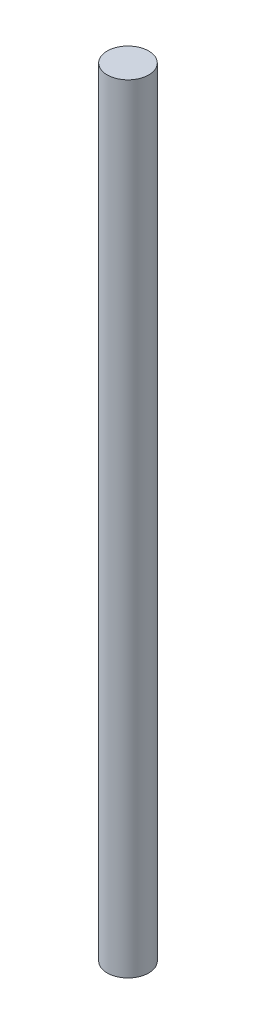
ISO-10303-21;
HEADER;
FILE_DESCRIPTION(('STEP AP214'),'2;1');
FILE_NAME('part.step','',(''),(''),'','','');
FILE_SCHEMA(('AUTOMOTIVE_DESIGN { 1 0 10303 214 1 1 1 1 }'));
ENDSEC;
DATA;
#1=APPLICATION_CONTEXT('core data for automotive mechanical design processes');
#2=APPLICATION_PROTOCOL_DEFINITION('international standard','automotive_design',2000,#1);
#3=PRODUCT_CONTEXT('',#1,'mechanical');
#4=PRODUCT('Part','Part','',(#3));
#5=PRODUCT_RELATED_PRODUCT_CATEGORY('part','',(#4));
#6=PRODUCT_DEFINITION_FORMATION('','',#4);
#7=PRODUCT_DEFINITION_CONTEXT('part definition',#1,'design');
#8=PRODUCT_DEFINITION('design','',#6,#7);
#9=PRODUCT_DEFINITION_SHAPE('','',#8);
#10=(LENGTH_UNIT() NAMED_UNIT(*) SI_UNIT(.MILLI.,.METRE.));
#11=(NAMED_UNIT(*) PLANE_ANGLE_UNIT() SI_UNIT($,.RADIAN.));
#12=(NAMED_UNIT(*) SI_UNIT($,.STERADIAN.) SOLID_ANGLE_UNIT());
#13=UNCERTAINTY_MEASURE_WITH_UNIT(LENGTH_MEASURE(1.E-05),#10,'distance_accuracy_value','');
#14=(GEOMETRIC_REPRESENTATION_CONTEXT(3) GLOBAL_UNCERTAINTY_ASSIGNED_CONTEXT((#13)) GLOBAL_UNIT_ASSIGNED_CONTEXT((#10,
#11,#12)) REPRESENTATION_CONTEXT('',''));
#15=CARTESIAN_POINT('',(0.,0.,0.));
#16=DIRECTION('',(0.,0.,1.));
#17=DIRECTION('',(1.,0.,0.));
#18=AXIS2_PLACEMENT_3D('',#15,#16,#17);
#19=CARTESIAN_POINT('',(0.,952.5,0.));
#20=DIRECTION('',(0.,-1.,0.));
#21=DIRECTION('',(0.,0.,-1.));
#22=AXIS2_PLACEMENT_3D('',#19,#20,#21);
#23=CYLINDRICAL_SURFACE('',#22,25.4);
#24=CARTESIAN_POINT('',(0.,952.5,0.));
#25=DIRECTION('',(0.,1.,0.));
#26=DIRECTION('',(0.,0.,1.));
#27=AXIS2_PLACEMENT_3D('',#24,#25,#26);
#28=CIRCLE('',#27,25.4);
#29=CARTESIAN_POINT('',(0.,952.5,25.4));
#30=VERTEX_POINT('',#29);
#31=EDGE_CURVE('E10',#30,#30,#28,.T.);
#32=ORIENTED_EDGE('',*,*,#31,.F.);
#33=EDGE_LOOP('',(#32));
#34=FACE_BOUND('',#33,.T.);
#35=CARTESIAN_POINT('',(0.,0.,0.));
#36=DIRECTION('',(0.,1.,0.));
#37=DIRECTION('',(0.,0.,1.));
#38=AXIS2_PLACEMENT_3D('',#35,#36,#37);
#39=CIRCLE('',#38,25.4);
#40=CARTESIAN_POINT('',(0.,0.,25.4));
#41=VERTEX_POINT('',#40);
#42=EDGE_CURVE('E40',#41,#41,#39,.T.);
#43=ORIENTED_EDGE('',*,*,#42,.T.);
#44=EDGE_LOOP('',(#43));
#45=FACE_BOUND('',#44,.T.);
#46=ADVANCED_FACE('F37',(#34,#45),#23,.T.);
#47=CARTESIAN_POINT('',(0.,952.5,0.));
#48=DIRECTION('',(0.,1.,0.));
#49=DIRECTION('',(0.,0.,1.));
#50=AXIS2_PLACEMENT_3D('',#47,#48,#49);
#51=PLANE('',#50);
#52=ORIENTED_EDGE('',*,*,#31,.T.);
#53=EDGE_LOOP('',(#52));
#54=FACE_BOUND('',#53,.T.);
#55=ADVANCED_FACE('F54',(#54),#51,.T.);
#56=CARTESIAN_POINT('',(0.,0.,0.));
#57=DIRECTION('',(0.,1.,0.));
#58=DIRECTION('',(0.,0.,1.));
#59=AXIS2_PLACEMENT_3D('',#56,#57,#58);
#60=PLANE('',#59);
#61=ORIENTED_EDGE('',*,*,#42,.F.);
#62=EDGE_LOOP('',(#61));
#63=FACE_BOUND('',#62,.T.);
#64=ADVANCED_FACE('F52',(#63),#60,.F.);
#65=CLOSED_SHELL('',(#46,#55,#64));
#66=MANIFOLD_SOLID_BREP('B2',#65);
#67=ADVANCED_BREP_SHAPE_REPRESENTATION('',(#18,#66),#14);
#68=SHAPE_DEFINITION_REPRESENTATION(#9,#67);
ENDSEC;
END-ISO-10303-21;
